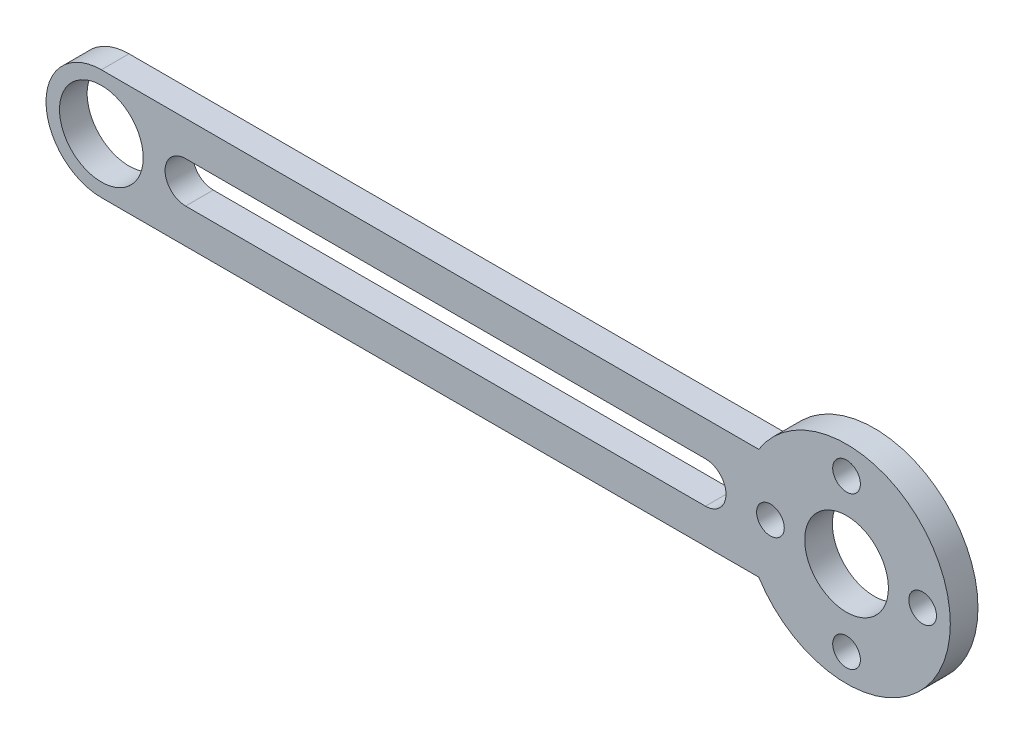
ISO-10303-21;
HEADER;
FILE_DESCRIPTION(('STEP AP214'),'2;1');
FILE_NAME('part.step','',(''),(''),'','','');
FILE_SCHEMA(('AUTOMOTIVE_DESIGN { 1 0 10303 214 1 1 1 1 }'));
ENDSEC;
DATA;
#1=APPLICATION_CONTEXT('core data for automotive mechanical design processes');
#2=APPLICATION_PROTOCOL_DEFINITION('international standard','automotive_design',2000,#1);
#3=PRODUCT_CONTEXT('',#1,'mechanical');
#4=PRODUCT('Part','Part','',(#3));
#5=PRODUCT_RELATED_PRODUCT_CATEGORY('part','',(#4));
#6=PRODUCT_DEFINITION_FORMATION('','',#4);
#7=PRODUCT_DEFINITION_CONTEXT('part definition',#1,'design');
#8=PRODUCT_DEFINITION('design','',#6,#7);
#9=PRODUCT_DEFINITION_SHAPE('','',#8);
#10=(LENGTH_UNIT() NAMED_UNIT(*) SI_UNIT(.MILLI.,.METRE.));
#11=(NAMED_UNIT(*) PLANE_ANGLE_UNIT() SI_UNIT($,.RADIAN.));
#12=(NAMED_UNIT(*) SI_UNIT($,.STERADIAN.) SOLID_ANGLE_UNIT());
#13=UNCERTAINTY_MEASURE_WITH_UNIT(LENGTH_MEASURE(1.E-05),#10,'distance_accuracy_value','');
#14=(GEOMETRIC_REPRESENTATION_CONTEXT(3) GLOBAL_UNCERTAINTY_ASSIGNED_CONTEXT((#13)) GLOBAL_UNIT_ASSIGNED_CONTEXT((#10,
#11,#12)) REPRESENTATION_CONTEXT('',''));
#15=CARTESIAN_POINT('',(0.,0.,0.));
#16=DIRECTION('',(0.,0.,1.));
#17=DIRECTION('',(1.,0.,0.));
#18=AXIS2_PLACEMENT_3D('',#15,#16,#17);
#19=CARTESIAN_POINT('',(0.,4.,2.));
#20=DIRECTION('',(0.,1.,0.));
#21=DIRECTION('',(0.,0.,1.));
#22=AXIS2_PLACEMENT_3D('',#19,#20,#21);
#23=PLANE('',#22);
#24=DIRECTION('',(1.,0.,0.));
#25=VECTOR('',#24,1.);
#26=CARTESIAN_POINT('',(0.,4.,0.));
#27=LINE('',#26,#25);
#28=CARTESIAN_POINT('',(-53.8502428277937,4.,0.));
#29=VERTEX_POINT('',#28);
#30=CARTESIAN_POINT('',(-6.34428877022476,4.,0.));
#31=VERTEX_POINT('',#30);
#32=EDGE_CURVE('E150',#29,#31,#27,.T.);
#33=ORIENTED_EDGE('',*,*,#32,.F.);
#34=DIRECTION('',(0.,0.,-1.));
#35=VECTOR('',#34,1.);
#36=CARTESIAN_POINT('',(-53.8502428277937,4.,2.));
#37=LINE('',#36,#35);
#38=CARTESIAN_POINT('',(-53.8502428277937,4.,2.));
#39=VERTEX_POINT('',#38);
#40=EDGE_CURVE('E11',#39,#29,#37,.T.);
#41=ORIENTED_EDGE('',*,*,#40,.F.);
#42=DIRECTION('',(1.,0.,0.));
#43=VECTOR('',#42,1.);
#44=CARTESIAN_POINT('',(0.,4.,2.));
#45=LINE('',#44,#43);
#46=CARTESIAN_POINT('',(-6.34428877022476,4.,2.));
#47=VERTEX_POINT('',#46);
#48=EDGE_CURVE('E126',#39,#47,#45,.T.);
#49=ORIENTED_EDGE('',*,*,#48,.T.);
#50=DIRECTION('',(0.,0.,-1.));
#51=VECTOR('',#50,1.);
#52=CARTESIAN_POINT('',(-6.34428877022476,4.,2.));
#53=LINE('',#52,#51);
#54=EDGE_CURVE('E91',#47,#31,#53,.T.);
#55=ORIENTED_EDGE('',*,*,#54,.T.);
#56=EDGE_LOOP('',(#33,#41,#49,#55));
#57=FACE_BOUND('',#56,.T.);
#58=ADVANCED_FACE('F38',(#57),#23,.T.);
#59=CARTESIAN_POINT('',(-53.8502428277937,0.,2.));
#60=DIRECTION('',(0.,0.,-1.));
#61=DIRECTION('',(-1.,0.,0.));
#62=AXIS2_PLACEMENT_3D('',#59,#60,#61);
#63=CYLINDRICAL_SURFACE('',#62,4.);
#64=CARTESIAN_POINT('',(-53.8502428277937,0.,0.));
#65=DIRECTION('',(0.,0.,1.));
#66=DIRECTION('',(1.,0.,0.));
#67=AXIS2_PLACEMENT_3D('',#64,#65,#66);
#68=CIRCLE('',#67,4.);
#69=CARTESIAN_POINT('',(-53.8502428277937,-4.,0.));
#70=VERTEX_POINT('',#69);
#71=EDGE_CURVE('E131',#29,#70,#68,.T.);
#72=ORIENTED_EDGE('',*,*,#71,.T.);
#73=DIRECTION('',(0.,0.,-1.));
#74=VECTOR('',#73,1.);
#75=CARTESIAN_POINT('',(-53.8502428277937,-4.,2.));
#76=LINE('',#75,#74);
#77=CARTESIAN_POINT('',(-53.8502428277937,-4.,2.));
#78=VERTEX_POINT('',#77);
#79=EDGE_CURVE('E48',#78,#70,#76,.T.);
#80=ORIENTED_EDGE('',*,*,#79,.F.);
#81=CARTESIAN_POINT('',(-53.8502428277937,0.,2.));
#82=DIRECTION('',(0.,0.,1.));
#83=DIRECTION('',(1.,0.,0.));
#84=AXIS2_PLACEMENT_3D('',#81,#82,#83);
#85=CIRCLE('',#84,4.);
#86=EDGE_CURVE('E122',#39,#78,#85,.T.);
#87=ORIENTED_EDGE('',*,*,#86,.F.);
#88=ORIENTED_EDGE('',*,*,#40,.T.);
#89=EDGE_LOOP('',(#72,#80,#87,#88));
#90=FACE_BOUND('',#89,.T.);
#91=ADVANCED_FACE('F129',(#90),#63,.T.);
#92=CARTESIAN_POINT('',(0.,-4.,2.));
#93=DIRECTION('',(0.,1.,0.));
#94=DIRECTION('',(0.,0.,1.));
#95=AXIS2_PLACEMENT_3D('',#92,#93,#94);
#96=PLANE('',#95);
#97=DIRECTION('',(1.,0.,0.));
#98=VECTOR('',#97,1.);
#99=CARTESIAN_POINT('',(0.,-4.,0.));
#100=LINE('',#99,#98);
#101=CARTESIAN_POINT('',(-6.34428877022476,-4.,0.));
#102=VERTEX_POINT('',#101);
#103=EDGE_CURVE('E147',#70,#102,#100,.T.);
#104=ORIENTED_EDGE('',*,*,#103,.T.);
#105=DIRECTION('',(0.,0.,-1.));
#106=VECTOR('',#105,1.);
#107=CARTESIAN_POINT('',(-6.34428877022476,-4.,2.));
#108=LINE('',#107,#106);
#109=CARTESIAN_POINT('',(-6.34428877022476,-4.,2.));
#110=VERTEX_POINT('',#109);
#111=EDGE_CURVE('E121',#110,#102,#108,.T.);
#112=ORIENTED_EDGE('',*,*,#111,.F.);
#113=DIRECTION('',(1.,0.,0.));
#114=VECTOR('',#113,1.);
#115=CARTESIAN_POINT('',(0.,-4.,2.));
#116=LINE('',#115,#114);
#117=EDGE_CURVE('E115',#78,#110,#116,.T.);
#118=ORIENTED_EDGE('',*,*,#117,.F.);
#119=ORIENTED_EDGE('',*,*,#79,.T.);
#120=EDGE_LOOP('',(#104,#112,#118,#119));
#121=FACE_BOUND('',#120,.T.);
#122=ADVANCED_FACE('F118',(#121),#96,.F.);
#123=CARTESIAN_POINT('',(-10.1945582776389,0.,2.));
#124=DIRECTION('',(0.,0.,-1.));
#125=DIRECTION('',(-1.,0.,0.));
#126=AXIS2_PLACEMENT_3D('',#123,#124,#125);
#127=CYLINDRICAL_SURFACE('',#126,1.48347158184053);
#128=CARTESIAN_POINT('',(-10.1945582776389,0.,0.));
#129=DIRECTION('',(0.,0.,1.));
#130=DIRECTION('',(1.,0.,0.));
#131=AXIS2_PLACEMENT_3D('',#128,#129,#130);
#132=CIRCLE('',#131,1.48347158184053);
#133=CARTESIAN_POINT('',(-10.1945582776389,-1.48347158184053,0.));
#134=VERTEX_POINT('',#133);
#135=CARTESIAN_POINT('',(-10.1945582776389,1.48347158184053,0.));
#136=VERTEX_POINT('',#135);
#137=EDGE_CURVE('E176',#134,#136,#132,.T.);
#138=ORIENTED_EDGE('',*,*,#137,.F.);
#139=DIRECTION('',(0.,0.,-1.));
#140=VECTOR('',#139,1.);
#141=CARTESIAN_POINT('',(-10.1945582776389,-1.48347158184053,2.));
#142=LINE('',#141,#140);
#143=CARTESIAN_POINT('',(-10.1945582776389,-1.48347158184053,2.));
#144=VERTEX_POINT('',#143);
#145=EDGE_CURVE('E98',#144,#134,#142,.T.);
#146=ORIENTED_EDGE('',*,*,#145,.F.);
#147=CARTESIAN_POINT('',(-10.1945582776389,0.,2.));
#148=DIRECTION('',(0.,0.,1.));
#149=DIRECTION('',(1.,0.,0.));
#150=AXIS2_PLACEMENT_3D('',#147,#148,#149);
#151=CIRCLE('',#150,1.48347158184053);
#152=CARTESIAN_POINT('',(-10.1945582776389,1.48347158184053,2.));
#153=VERTEX_POINT('',#152);
#154=EDGE_CURVE('E146',#144,#153,#151,.T.);
#155=ORIENTED_EDGE('',*,*,#154,.T.);
#156=DIRECTION('',(0.,0.,-1.));
#157=VECTOR('',#156,1.);
#158=CARTESIAN_POINT('',(-10.1945582776389,1.48347158184053,2.));
#159=LINE('',#158,#157);
#160=EDGE_CURVE('E136',#153,#136,#159,.T.);
#161=ORIENTED_EDGE('',*,*,#160,.T.);
#162=EDGE_LOOP('',(#138,#146,#155,#161));
#163=FACE_BOUND('',#162,.T.);
#164=ADVANCED_FACE('F40',(#163),#127,.F.);
#165=CARTESIAN_POINT('',(0.,-1.48347158184053,2.));
#166=DIRECTION('',(0.,1.,0.));
#167=DIRECTION('',(0.,0.,1.));
#168=AXIS2_PLACEMENT_3D('',#165,#166,#167);
#169=PLANE('',#168);
#170=DIRECTION('',(1.,0.,0.));
#171=VECTOR('',#170,1.);
#172=CARTESIAN_POINT('',(0.,-1.48347158184053,0.));
#173=LINE('',#172,#171);
#174=CARTESIAN_POINT('',(-47.7619263249509,-1.48347158184053,0.));
#175=VERTEX_POINT('',#174);
#176=EDGE_CURVE('E173',#175,#134,#173,.T.);
#177=ORIENTED_EDGE('',*,*,#176,.F.);
#178=DIRECTION('',(0.,0.,-1.));
#179=VECTOR('',#178,1.);
#180=CARTESIAN_POINT('',(-47.7619263249509,-1.48347158184053,2.));
#181=LINE('',#180,#179);
#182=CARTESIAN_POINT('',(-47.7619263249509,-1.48347158184053,2.));
#183=VERTEX_POINT('',#182);
#184=EDGE_CURVE('E140',#183,#175,#181,.T.);
#185=ORIENTED_EDGE('',*,*,#184,.F.);
#186=DIRECTION('',(1.,0.,0.));
#187=VECTOR('',#186,1.);
#188=CARTESIAN_POINT('',(0.,-1.48347158184053,2.));
#189=LINE('',#188,#187);
#190=EDGE_CURVE('E201',#183,#144,#189,.T.);
#191=ORIENTED_EDGE('',*,*,#190,.T.);
#192=ORIENTED_EDGE('',*,*,#145,.T.);
#193=EDGE_LOOP('',(#177,#185,#191,#192));
#194=FACE_BOUND('',#193,.T.);
#195=ADVANCED_FACE('F257',(#194),#169,.T.);
#196=CARTESIAN_POINT('',(-47.7619263249509,0.,2.));
#197=DIRECTION('',(0.,0.,-1.));
#198=DIRECTION('',(-1.,0.,0.));
#199=AXIS2_PLACEMENT_3D('',#196,#197,#198);
#200=CYLINDRICAL_SURFACE('',#199,1.48347158184053);
#201=CARTESIAN_POINT('',(-47.7619263249509,0.,0.));
#202=DIRECTION('',(0.,0.,1.));
#203=DIRECTION('',(1.,0.,0.));
#204=AXIS2_PLACEMENT_3D('',#201,#202,#203);
#205=CIRCLE('',#204,1.48347158184053);
#206=CARTESIAN_POINT('',(-47.7619263249509,1.48347158184053,0.));
#207=VERTEX_POINT('',#206);
#208=EDGE_CURVE('E170',#207,#175,#205,.T.);
#209=ORIENTED_EDGE('',*,*,#208,.F.);
#210=DIRECTION('',(0.,0.,-1.));
#211=VECTOR('',#210,1.);
#212=CARTESIAN_POINT('',(-47.7619263249509,1.48347158184053,2.));
#213=LINE('',#212,#211);
#214=CARTESIAN_POINT('',(-47.7619263249509,1.48347158184053,2.));
#215=VERTEX_POINT('',#214);
#216=EDGE_CURVE('E138',#215,#207,#213,.T.);
#217=ORIENTED_EDGE('',*,*,#216,.F.);
#218=CARTESIAN_POINT('',(-47.7619263249509,0.,2.));
#219=DIRECTION('',(0.,0.,1.));
#220=DIRECTION('',(1.,0.,0.));
#221=AXIS2_PLACEMENT_3D('',#218,#219,#220);
#222=CIRCLE('',#221,1.48347158184053);
#223=EDGE_CURVE('E198',#215,#183,#222,.T.);
#224=ORIENTED_EDGE('',*,*,#223,.T.);
#225=ORIENTED_EDGE('',*,*,#184,.T.);
#226=EDGE_LOOP('',(#209,#217,#224,#225));
#227=FACE_BOUND('',#226,.T.);
#228=ADVANCED_FACE('F234',(#227),#200,.F.);
#229=CARTESIAN_POINT('',(5.5,0.,2.));
#230=DIRECTION('',(0.,0.,-1.));
#231=DIRECTION('',(-1.,0.,0.));
#232=AXIS2_PLACEMENT_3D('',#229,#230,#231);
#233=CYLINDRICAL_SURFACE('',#232,1.);
#234=CARTESIAN_POINT('',(5.5,0.,2.));
#235=DIRECTION('',(0.,0.,1.));
#236=DIRECTION('',(1.,0.,0.));
#237=AXIS2_PLACEMENT_3D('',#234,#235,#236);
#238=CIRCLE('',#237,1.);
#239=CARTESIAN_POINT('',(6.5,0.,2.));
#240=VERTEX_POINT('',#239);
#241=EDGE_CURVE('E181',#240,#240,#238,.T.);
#242=ORIENTED_EDGE('',*,*,#241,.T.);
#243=EDGE_LOOP('',(#242));
#244=FACE_BOUND('',#243,.T.);
#245=CARTESIAN_POINT('',(5.5,0.,0.));
#246=DIRECTION('',(0.,0.,1.));
#247=DIRECTION('',(1.,0.,0.));
#248=AXIS2_PLACEMENT_3D('',#245,#246,#247);
#249=CIRCLE('',#248,1.);
#250=CARTESIAN_POINT('',(6.5,0.,0.));
#251=VERTEX_POINT('',#250);
#252=EDGE_CURVE('E152',#251,#251,#249,.T.);
#253=ORIENTED_EDGE('',*,*,#252,.F.);
#254=EDGE_LOOP('',(#253));
#255=FACE_BOUND('',#254,.T.);
#256=ADVANCED_FACE('F230',(#244,#255),#233,.F.);
#257=CARTESIAN_POINT('',(-5.5,0.,2.));
#258=DIRECTION('',(0.,0.,-1.));
#259=DIRECTION('',(-1.,0.,0.));
#260=AXIS2_PLACEMENT_3D('',#257,#258,#259);
#261=CYLINDRICAL_SURFACE('',#260,1.);
#262=CARTESIAN_POINT('',(-5.5,0.,2.));
#263=DIRECTION('',(0.,0.,1.));
#264=DIRECTION('',(1.,0.,0.));
#265=AXIS2_PLACEMENT_3D('',#262,#263,#264);
#266=CIRCLE('',#265,1.);
#267=CARTESIAN_POINT('',(-4.5,0.,2.));
#268=VERTEX_POINT('',#267);
#269=EDGE_CURVE('E184',#268,#268,#266,.T.);
#270=ORIENTED_EDGE('',*,*,#269,.T.);
#271=EDGE_LOOP('',(#270));
#272=FACE_BOUND('',#271,.T.);
#273=CARTESIAN_POINT('',(-5.5,0.,0.));
#274=DIRECTION('',(0.,0.,1.));
#275=DIRECTION('',(1.,0.,0.));
#276=AXIS2_PLACEMENT_3D('',#273,#274,#275);
#277=CIRCLE('',#276,1.);
#278=CARTESIAN_POINT('',(-4.5,0.,0.));
#279=VERTEX_POINT('',#278);
#280=EDGE_CURVE('E155',#279,#279,#277,.T.);
#281=ORIENTED_EDGE('',*,*,#280,.F.);
#282=EDGE_LOOP('',(#281));
#283=FACE_BOUND('',#282,.T.);
#284=ADVANCED_FACE('F233',(#272,#283),#261,.F.);
#285=CARTESIAN_POINT('',(-53.8502428277937,0.,2.));
#286=DIRECTION('',(0.,0.,-1.));
#287=DIRECTION('',(-1.,0.,0.));
#288=AXIS2_PLACEMENT_3D('',#285,#286,#287);
#289=CYLINDRICAL_SURFACE('',#288,3.025);
#290=CARTESIAN_POINT('',(-53.8502428277937,0.,2.));
#291=DIRECTION('',(0.,0.,1.));
#292=DIRECTION('',(1.,0.,0.));
#293=AXIS2_PLACEMENT_3D('',#290,#291,#292);
#294=CIRCLE('',#293,3.025);
#295=CARTESIAN_POINT('',(-50.8252428277937,0.,2.));
#296=VERTEX_POINT('',#295);
#297=EDGE_CURVE('E187',#296,#296,#294,.T.);
#298=ORIENTED_EDGE('',*,*,#297,.T.);
#299=EDGE_LOOP('',(#298));
#300=FACE_BOUND('',#299,.T.);
#301=CARTESIAN_POINT('',(-53.8502428277937,0.,0.));
#302=DIRECTION('',(0.,0.,1.));
#303=DIRECTION('',(1.,0.,0.));
#304=AXIS2_PLACEMENT_3D('',#301,#302,#303);
#305=CIRCLE('',#304,3.025);
#306=CARTESIAN_POINT('',(-50.8252428277937,0.,0.));
#307=VERTEX_POINT('',#306);
#308=EDGE_CURVE('E158',#307,#307,#305,.T.);
#309=ORIENTED_EDGE('',*,*,#308,.F.);
#310=EDGE_LOOP('',(#309));
#311=FACE_BOUND('',#310,.T.);
#312=ADVANCED_FACE('F238',(#300,#311),#289,.F.);
#313=CARTESIAN_POINT('',(0.,-5.5,2.));
#314=DIRECTION('',(0.,0.,-1.));
#315=DIRECTION('',(-1.,0.,0.));
#316=AXIS2_PLACEMENT_3D('',#313,#314,#315);
#317=CYLINDRICAL_SURFACE('',#316,1.);
#318=CARTESIAN_POINT('',(0.,-5.5,2.));
#319=DIRECTION('',(0.,0.,1.));
#320=DIRECTION('',(1.,0.,0.));
#321=AXIS2_PLACEMENT_3D('',#318,#319,#320);
#322=CIRCLE('',#321,1.);
#323=CARTESIAN_POINT('',(0.99999999999998,-5.5,2.));
#324=VERTEX_POINT('',#323);
#325=EDGE_CURVE('E190',#324,#324,#322,.T.);
#326=ORIENTED_EDGE('',*,*,#325,.T.);
#327=EDGE_LOOP('',(#326));
#328=FACE_BOUND('',#327,.T.);
#329=CARTESIAN_POINT('',(0.,-5.5,0.));
#330=DIRECTION('',(0.,0.,1.));
#331=DIRECTION('',(1.,0.,0.));
#332=AXIS2_PLACEMENT_3D('',#329,#330,#331);
#333=CIRCLE('',#332,1.);
#334=CARTESIAN_POINT('',(0.99999999999998,-5.5,0.));
#335=VERTEX_POINT('',#334);
#336=EDGE_CURVE('E161',#335,#335,#333,.T.);
#337=ORIENTED_EDGE('',*,*,#336,.F.);
#338=EDGE_LOOP('',(#337));
#339=FACE_BOUND('',#338,.T.);
#340=ADVANCED_FACE('F242',(#328,#339),#317,.F.);
#341=CARTESIAN_POINT('',(0.,5.5,2.));
#342=DIRECTION('',(0.,0.,-1.));
#343=DIRECTION('',(-1.,0.,0.));
#344=AXIS2_PLACEMENT_3D('',#341,#342,#343);
#345=CYLINDRICAL_SURFACE('',#344,1.);
#346=CARTESIAN_POINT('',(0.,5.5,2.));
#347=DIRECTION('',(0.,0.,1.));
#348=DIRECTION('',(1.,0.,0.));
#349=AXIS2_PLACEMENT_3D('',#346,#347,#348);
#350=CIRCLE('',#349,1.);
#351=CARTESIAN_POINT('',(1.00000000000006,5.5,2.));
#352=VERTEX_POINT('',#351);
#353=EDGE_CURVE('E193',#352,#352,#350,.T.);
#354=ORIENTED_EDGE('',*,*,#353,.T.);
#355=EDGE_LOOP('',(#354));
#356=FACE_BOUND('',#355,.T.);
#357=CARTESIAN_POINT('',(0.,5.5,0.));
#358=DIRECTION('',(0.,0.,1.));
#359=DIRECTION('',(1.,0.,0.));
#360=AXIS2_PLACEMENT_3D('',#357,#358,#359);
#361=CIRCLE('',#360,1.);
#362=CARTESIAN_POINT('',(1.00000000000006,5.5,0.));
#363=VERTEX_POINT('',#362);
#364=EDGE_CURVE('E164',#363,#363,#361,.T.);
#365=ORIENTED_EDGE('',*,*,#364,.F.);
#366=EDGE_LOOP('',(#365));
#367=FACE_BOUND('',#366,.T.);
#368=ADVANCED_FACE('F246',(#356,#367),#345,.F.);
#369=CARTESIAN_POINT('',(0.,1.48347158184053,2.));
#370=DIRECTION('',(0.,1.,0.));
#371=DIRECTION('',(0.,0.,1.));
#372=AXIS2_PLACEMENT_3D('',#369,#370,#371);
#373=PLANE('',#372);
#374=DIRECTION('',(1.,0.,0.));
#375=VECTOR('',#374,1.);
#376=CARTESIAN_POINT('',(0.,1.48347158184053,0.));
#377=LINE('',#376,#375);
#378=EDGE_CURVE('E167',#207,#136,#377,.T.);
#379=ORIENTED_EDGE('',*,*,#378,.T.);
#380=ORIENTED_EDGE('',*,*,#160,.F.);
#381=DIRECTION('',(1.,0.,0.));
#382=VECTOR('',#381,1.);
#383=CARTESIAN_POINT('',(0.,1.48347158184053,2.));
#384=LINE('',#383,#382);
#385=EDGE_CURVE('E196',#215,#153,#384,.T.);
#386=ORIENTED_EDGE('',*,*,#385,.F.);
#387=ORIENTED_EDGE('',*,*,#216,.T.);
#388=EDGE_LOOP('',(#379,#380,#386,#387));
#389=FACE_BOUND('',#388,.T.);
#390=ADVANCED_FACE('F250',(#389),#373,.F.);
#391=CARTESIAN_POINT('',(0.,0.,2.));
#392=DIRECTION('',(0.,0.,-1.));
#393=DIRECTION('',(-1.,0.,0.));
#394=AXIS2_PLACEMENT_3D('',#391,#392,#393);
#395=CYLINDRICAL_SURFACE('',#394,7.5);
#396=CARTESIAN_POINT('',(0.,0.,0.));
#397=DIRECTION('',(0.,0.,1.));
#398=DIRECTION('',(1.,0.,0.));
#399=AXIS2_PLACEMENT_3D('',#396,#397,#398);
#400=CIRCLE('',#399,7.5);
#401=EDGE_CURVE('E84',#102,#31,#400,.T.);
#402=ORIENTED_EDGE('',*,*,#401,.T.);
#403=ORIENTED_EDGE('',*,*,#54,.F.);
#404=CARTESIAN_POINT('',(0.,0.,2.));
#405=DIRECTION('',(0.,0.,1.));
#406=DIRECTION('',(1.,0.,0.));
#407=AXIS2_PLACEMENT_3D('',#404,#405,#406);
#408=CIRCLE('',#407,7.5);
#409=EDGE_CURVE('E57',#110,#47,#408,.T.);
#410=ORIENTED_EDGE('',*,*,#409,.F.);
#411=ORIENTED_EDGE('',*,*,#111,.T.);
#412=EDGE_LOOP('',(#402,#403,#410,#411));
#413=FACE_BOUND('',#412,.T.);
#414=ADVANCED_FACE('F254',(#413),#395,.T.);
#415=CARTESIAN_POINT('',(0.,0.,2.));
#416=DIRECTION('',(0.,0.,1.));
#417=DIRECTION('',(1.,0.,0.));
#418=AXIS2_PLACEMENT_3D('',#415,#416,#417);
#419=PLANE('',#418);
#420=CARTESIAN_POINT('',(0.,0.,2.));
#421=DIRECTION('',(0.,0.,1.));
#422=DIRECTION('',(1.,0.,0.));
#423=AXIS2_PLACEMENT_3D('',#420,#421,#422);
#424=CIRCLE('',#423,3.025);
#425=CARTESIAN_POINT('',(3.025,0.,2.));
#426=VERTEX_POINT('',#425);
#427=EDGE_CURVE('E204',#426,#426,#424,.T.);
#428=ORIENTED_EDGE('',*,*,#427,.F.);
#429=EDGE_LOOP('',(#428));
#430=FACE_BOUND('',#429,.T.);
#431=ORIENTED_EDGE('',*,*,#154,.F.);
#432=ORIENTED_EDGE('',*,*,#190,.F.);
#433=ORIENTED_EDGE('',*,*,#223,.F.);
#434=ORIENTED_EDGE('',*,*,#385,.T.);
#435=EDGE_LOOP('',(#431,#432,#433,#434));
#436=FACE_BOUND('',#435,.T.);
#437=ORIENTED_EDGE('',*,*,#353,.F.);
#438=EDGE_LOOP('',(#437));
#439=FACE_BOUND('',#438,.T.);
#440=ORIENTED_EDGE('',*,*,#325,.F.);
#441=EDGE_LOOP('',(#440));
#442=FACE_BOUND('',#441,.T.);
#443=ORIENTED_EDGE('',*,*,#297,.F.);
#444=EDGE_LOOP('',(#443));
#445=FACE_BOUND('',#444,.T.);
#446=ORIENTED_EDGE('',*,*,#269,.F.);
#447=EDGE_LOOP('',(#446));
#448=FACE_BOUND('',#447,.T.);
#449=ORIENTED_EDGE('',*,*,#241,.F.);
#450=EDGE_LOOP('',(#449));
#451=FACE_BOUND('',#450,.T.);
#452=ORIENTED_EDGE('',*,*,#48,.F.);
#453=ORIENTED_EDGE('',*,*,#86,.T.);
#454=ORIENTED_EDGE('',*,*,#117,.T.);
#455=ORIENTED_EDGE('',*,*,#409,.T.);
#456=EDGE_LOOP('',(#452,#453,#454,#455));
#457=FACE_BOUND('',#456,.T.);
#458=ADVANCED_FACE('F125',(#430,#436,#439,#442,#445,#448,#451,#457),#419,.T.);
#459=CARTESIAN_POINT('',(0.,0.,0.));
#460=DIRECTION('',(0.,0.,1.));
#461=DIRECTION('',(1.,0.,0.));
#462=AXIS2_PLACEMENT_3D('',#459,#460,#461);
#463=PLANE('',#462);
#464=CARTESIAN_POINT('',(0.,0.,0.));
#465=DIRECTION('',(0.,0.,1.));
#466=DIRECTION('',(1.,0.,0.));
#467=AXIS2_PLACEMENT_3D('',#464,#465,#466);
#468=CIRCLE('',#467,3.025);
#469=CARTESIAN_POINT('',(3.025,0.,0.));
#470=VERTEX_POINT('',#469);
#471=EDGE_CURVE('E42',#470,#470,#468,.T.);
#472=ORIENTED_EDGE('',*,*,#471,.T.);
#473=EDGE_LOOP('',(#472));
#474=FACE_BOUND('',#473,.T.);
#475=ORIENTED_EDGE('',*,*,#137,.T.);
#476=ORIENTED_EDGE('',*,*,#378,.F.);
#477=ORIENTED_EDGE('',*,*,#208,.T.);
#478=ORIENTED_EDGE('',*,*,#176,.T.);
#479=EDGE_LOOP('',(#475,#476,#477,#478));
#480=FACE_BOUND('',#479,.T.);
#481=ORIENTED_EDGE('',*,*,#364,.T.);
#482=EDGE_LOOP('',(#481));
#483=FACE_BOUND('',#482,.T.);
#484=ORIENTED_EDGE('',*,*,#336,.T.);
#485=EDGE_LOOP('',(#484));
#486=FACE_BOUND('',#485,.T.);
#487=ORIENTED_EDGE('',*,*,#308,.T.);
#488=EDGE_LOOP('',(#487));
#489=FACE_BOUND('',#488,.T.);
#490=ORIENTED_EDGE('',*,*,#280,.T.);
#491=EDGE_LOOP('',(#490));
#492=FACE_BOUND('',#491,.T.);
#493=ORIENTED_EDGE('',*,*,#252,.T.);
#494=EDGE_LOOP('',(#493));
#495=FACE_BOUND('',#494,.T.);
#496=ORIENTED_EDGE('',*,*,#32,.T.);
#497=ORIENTED_EDGE('',*,*,#401,.F.);
#498=ORIENTED_EDGE('',*,*,#103,.F.);
#499=ORIENTED_EDGE('',*,*,#71,.F.);
#500=EDGE_LOOP('',(#496,#497,#498,#499));
#501=FACE_BOUND('',#500,.T.);
#502=ADVANCED_FACE('F211',(#474,#480,#483,#486,#489,#492,#495,#501),#463,.F.);
#503=CARTESIAN_POINT('',(0.,0.,-8.));
#504=DIRECTION('',(0.,0.,1.));
#505=DIRECTION('',(1.,0.,0.));
#506=AXIS2_PLACEMENT_3D('',#503,#504,#505);
#507=CYLINDRICAL_SURFACE('',#506,3.025);
#508=ORIENTED_EDGE('',*,*,#427,.T.);
#509=EDGE_LOOP('',(#508));
#510=FACE_BOUND('',#509,.T.);
#511=ORIENTED_EDGE('',*,*,#471,.F.);
#512=EDGE_LOOP('',(#511));
#513=FACE_BOUND('',#512,.T.);
#514=ADVANCED_FACE('F214',(#510,#513),#507,.F.);
#515=CLOSED_SHELL('',(#58,#91,#122,#164,#195,#228,#256,#284,#312,#340,#368,#390,#414,#458,#502,#514));
#516=MANIFOLD_SOLID_BREP('B2',#515);
#517=ADVANCED_BREP_SHAPE_REPRESENTATION('',(#18,#516),#14);
#518=SHAPE_DEFINITION_REPRESENTATION(#9,#517);
ENDSEC;
END-ISO-10303-21;
